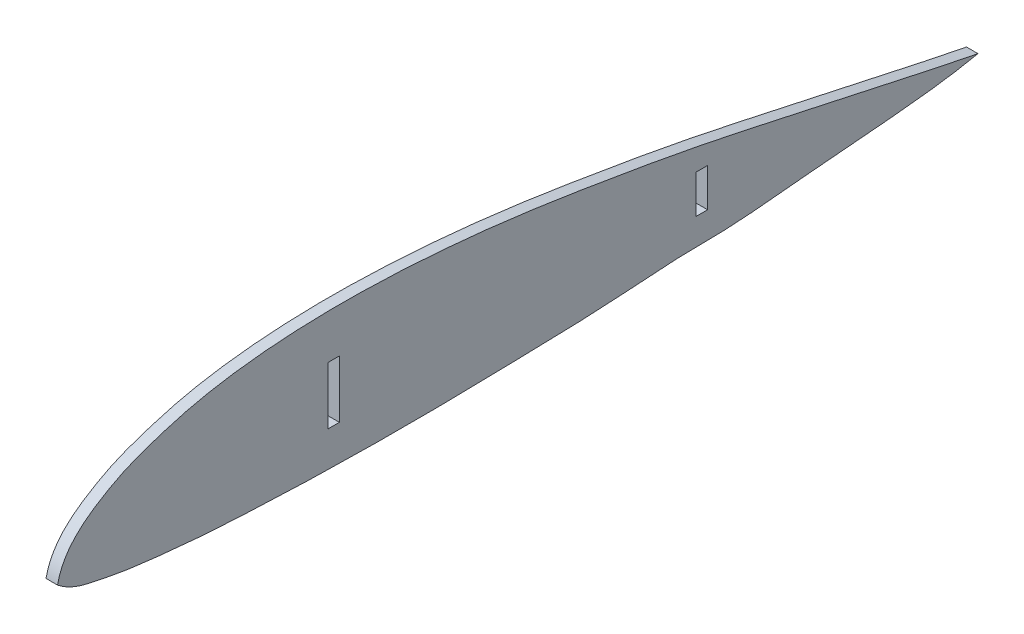
ISO-10303-21;
HEADER;
FILE_DESCRIPTION(('STEP AP214'),'2;1');
FILE_NAME('part.step','',(''),(''),'','','');
FILE_SCHEMA(('AUTOMOTIVE_DESIGN { 1 0 10303 214 1 1 1 1 }'));
ENDSEC;
DATA;
#1=APPLICATION_CONTEXT('core data for automotive mechanical design processes');
#2=APPLICATION_PROTOCOL_DEFINITION('international standard','automotive_design',2000,#1);
#3=PRODUCT_CONTEXT('',#1,'mechanical');
#4=PRODUCT('Part','Part','',(#3));
#5=PRODUCT_RELATED_PRODUCT_CATEGORY('part','',(#4));
#6=PRODUCT_DEFINITION_FORMATION('','',#4);
#7=PRODUCT_DEFINITION_CONTEXT('part definition',#1,'design');
#8=PRODUCT_DEFINITION('design','',#6,#7);
#9=PRODUCT_DEFINITION_SHAPE('','',#8);
#10=(LENGTH_UNIT() NAMED_UNIT(*) SI_UNIT(.MILLI.,.METRE.));
#11=(NAMED_UNIT(*) PLANE_ANGLE_UNIT() SI_UNIT($,.RADIAN.));
#12=(NAMED_UNIT(*) SI_UNIT($,.STERADIAN.) SOLID_ANGLE_UNIT());
#13=UNCERTAINTY_MEASURE_WITH_UNIT(LENGTH_MEASURE(1.E-05),#10,'distance_accuracy_value','');
#14=(GEOMETRIC_REPRESENTATION_CONTEXT(3) GLOBAL_UNCERTAINTY_ASSIGNED_CONTEXT((#13)) GLOBAL_UNIT_ASSIGNED_CONTEXT((#10,
#11,#12)) REPRESENTATION_CONTEXT('',''));
#15=CARTESIAN_POINT('',(0.,0.,0.));
#16=DIRECTION('',(0.,0.,1.));
#17=DIRECTION('',(1.,0.,0.));
#18=AXIS2_PLACEMENT_3D('',#15,#16,#17);
#19=CARTESIAN_POINT('',(3.,0.,240.));
#20=CARTESIAN_POINT('',(3.,-2.88663712280927,236.523911789921));
#21=CARTESIAN_POINT('',(3.,-4.06778606087941,230.220810861395));
#22=CARTESIAN_POINT('',(3.,-5.64877990651582,222.028601874124));
#23=CARTESIAN_POINT('',(3.,-6.60851401532716,214.009642515101));
#24=CARTESIAN_POINT('',(3.,-7.65058139006474,204.019456847261));
#25=CARTESIAN_POINT('',(3.,-8.62100436946901,188.0105436438));
#26=CARTESIAN_POINT('',(3.,-9.35502805275515,168.008371033474));
#27=CARTESIAN_POINT('',(3.,-9.54465584837777,143.997445941081));
#28=CARTESIAN_POINT('',(3.,-9.00057164569615,119.996434597562));
#29=CARTESIAN_POINT('',(3.,-8.45231331914167,95.9841207137069));
#30=CARTESIAN_POINT('',(3.,-6.86154925632092,79.4444514819222));
#31=CARTESIAN_POINT('',(3.,-6.94135781790873,63.4128510279465));
#32=CARTESIAN_POINT('',(3.,-5.14929657813988,47.4214800178839));
#33=CARTESIAN_POINT('',(3.,-3.34616289016771,23.9519910613881));
#34=CARTESIAN_POINT('',(3.,-1.67223814751534,7.91601145609598));
#35=CARTESIAN_POINT('',(3.,0.,0.));
#36=B_SPLINE_CURVE_WITH_KNOTS('',3,(#19,#20,#21,#22,#23,#24,#25,#26,#27,#28,#29,#30,#31,#32,#33,
#34,#35),.UNSPECIFIED.,.F.,.F.,(4,1,1,1,1,1,1,1,1,1,1,1,1,1,4),(0.,0.0534752742490124,
0.078709310431568,0.103753203869046,0.153672751320013,0.203448048800785,0.302856430572072,
0.402198969890009,0.501554024856561,0.600954522211836,0.700430480598882,0.70748041607058,
0.79999645484155,0.899715684831644,1.),.UNSPECIFIED.);
#37=DIRECTION('',(-1.,0.,0.));
#38=VECTOR('',#37,1.);
#39=SURFACE_OF_LINEAR_EXTRUSION('',#36,#38);
#40=CARTESIAN_POINT('',(0.,0.,240.));
#41=CARTESIAN_POINT('',(0.,-2.88663712280927,236.523911789921));
#42=CARTESIAN_POINT('',(0.,-4.06778606087941,230.220810861395));
#43=CARTESIAN_POINT('',(0.,-5.64877990651582,222.028601874124));
#44=CARTESIAN_POINT('',(0.,-6.60851401532716,214.009642515101));
#45=CARTESIAN_POINT('',(0.,-7.65058139006474,204.019456847261));
#46=CARTESIAN_POINT('',(0.,-8.62100436946901,188.0105436438));
#47=CARTESIAN_POINT('',(0.,-9.35502805275515,168.008371033474));
#48=CARTESIAN_POINT('',(0.,-9.54465584837777,143.997445941081));
#49=CARTESIAN_POINT('',(0.,-9.00057164569615,119.996434597562));
#50=CARTESIAN_POINT('',(0.,-8.45231331914167,95.9841207137069));
#51=CARTESIAN_POINT('',(0.,-6.86154925632092,79.4444514819222));
#52=CARTESIAN_POINT('',(0.,-6.94135781790873,63.4128510279465));
#53=CARTESIAN_POINT('',(0.,-5.14929657813988,47.4214800178839));
#54=CARTESIAN_POINT('',(0.,-3.34616289016771,23.9519910613881));
#55=CARTESIAN_POINT('',(0.,-1.67223814751534,7.91601145609598));
#56=CARTESIAN_POINT('',(0.,0.,0.));
#57=B_SPLINE_CURVE_WITH_KNOTS('',3,(#40,#41,#42,#43,#44,#45,#46,#47,#48,#49,#50,#51,#52,#53,#54,
#55,#56),.UNSPECIFIED.,.F.,.F.,(4,1,1,1,1,1,1,1,1,1,1,1,1,1,4),(0.,0.0534752742490124,
0.078709310431568,0.103753203869046,0.153672751320013,0.203448048800785,0.302856430572072,
0.402198969890009,0.501554024856561,0.600954522211836,0.700430480598882,0.70748041607058,
0.79999645484155,0.899715684831644,1.),.UNSPECIFIED.);
#58=CARTESIAN_POINT('',(0.,0.,240.));
#59=VERTEX_POINT('',#58);
#60=CARTESIAN_POINT('',(0.,0.,0.));
#61=VERTEX_POINT('',#60);
#62=EDGE_CURVE('E168',#59,#61,#57,.T.);
#63=ORIENTED_EDGE('',*,*,#62,.T.);
#64=DIRECTION('',(-1.,0.,0.));
#65=VECTOR('',#64,1.);
#66=CARTESIAN_POINT('',(3.,0.,0.));
#67=LINE('',#66,#65);
#68=CARTESIAN_POINT('',(3.,0.,0.));
#69=VERTEX_POINT('',#68);
#70=EDGE_CURVE('E11',#69,#61,#67,.T.);
#71=ORIENTED_EDGE('',*,*,#70,.F.);
#72=CARTESIAN_POINT('',(3.,0.,240.));
#73=VERTEX_POINT('',#72);
#74=EDGE_CURVE('E214',#73,#69,#36,.T.);
#75=ORIENTED_EDGE('',*,*,#74,.F.);
#76=DIRECTION('',(-1.,0.,0.));
#77=VECTOR('',#76,1.);
#78=CARTESIAN_POINT('',(3.,0.,240.));
#79=LINE('',#78,#77);
#80=EDGE_CURVE('E51',#73,#59,#79,.T.);
#81=ORIENTED_EDGE('',*,*,#80,.T.);
#82=EDGE_LOOP('',(#63,#71,#75,#81));
#83=FACE_BOUND('',#82,.T.);
#84=ADVANCED_FACE('F42',(#83),#39,.F.);
#85=CARTESIAN_POINT('',(3.,0.,0.));
#86=CARTESIAN_POINT('',(3.,1.52360068225762,8.03746926130975));
#87=CARTESIAN_POINT('',(3.,5.17138323074117,23.9897917168263));
#88=CARTESIAN_POINT('',(3.,10.2205786034995,48.0059783922376));
#89=CARTESIAN_POINT('',(3.,15.5619770262737,71.9126579513757));
#90=CARTESIAN_POINT('',(3.,19.7588120032883,95.9537600079154));
#91=CARTESIAN_POINT('',(3.,23.5677508672796,119.918298993928));
#92=CARTESIAN_POINT('',(3.,26.0263882263808,143.945589986485));
#93=CARTESIAN_POINT('',(3.,26.9601439821251,168.007150596988));
#94=CARTESIAN_POINT('',(3.,25.8933216802265,188.104616678397));
#95=CARTESIAN_POINT('',(3.,23.2639042392419,204.156129060536));
#96=CARTESIAN_POINT('',(3.,20.3434828261758,214.111867769092));
#97=CARTESIAN_POINT('',(3.,17.4120912155664,222.175332594537));
#98=CARTESIAN_POINT('',(3.,12.3378274401084,231.611968899749));
#99=CARTESIAN_POINT('',(3.,6.88597595591278,238.539586147514));
#100=CARTESIAN_POINT('',(3.,0.,240.));
#101=B_SPLINE_CURVE_WITH_KNOTS('',3,(#85,#86,#87,#88,#89,#90,#91,#92,#93,#94,#95,#96,#97,#98,
#99,#100),.UNSPECIFIED.,.F.,.F.,(4,1,1,1,1,1,1,1,1,1,1,1,1,4),(0.,0.0976537739938577,
0.195364998835535,0.293026196954694,0.390079704897671,0.486695277187024,0.582699676897636,
0.678273314662547,0.77397516907434,0.822435696462195,0.872109787552887,0.897672395288057,
0.924653988799848,1.),.UNSPECIFIED.);
#102=DIRECTION('',(-1.,0.,0.));
#103=VECTOR('',#102,1.);
#104=SURFACE_OF_LINEAR_EXTRUSION('',#101,#103);
#105=CARTESIAN_POINT('',(0.,0.,0.));
#106=CARTESIAN_POINT('',(0.,1.52360068225762,8.03746926130975));
#107=CARTESIAN_POINT('',(0.,5.17138323074117,23.9897917168263));
#108=CARTESIAN_POINT('',(0.,10.2205786034995,48.0059783922376));
#109=CARTESIAN_POINT('',(0.,15.5619770262737,71.9126579513757));
#110=CARTESIAN_POINT('',(0.,19.7588120032883,95.9537600079154));
#111=CARTESIAN_POINT('',(0.,23.5677508672796,119.918298993928));
#112=CARTESIAN_POINT('',(0.,26.0263882263808,143.945589986485));
#113=CARTESIAN_POINT('',(0.,26.9601439821251,168.007150596988));
#114=CARTESIAN_POINT('',(0.,25.8933216802265,188.104616678397));
#115=CARTESIAN_POINT('',(0.,23.2639042392419,204.156129060536));
#116=CARTESIAN_POINT('',(0.,20.3434828261758,214.111867769092));
#117=CARTESIAN_POINT('',(0.,17.4120912155664,222.175332594537));
#118=CARTESIAN_POINT('',(0.,12.3378274401084,231.611968899749));
#119=CARTESIAN_POINT('',(0.,6.88597595591278,238.539586147514));
#120=CARTESIAN_POINT('',(0.,0.,240.));
#121=B_SPLINE_CURVE_WITH_KNOTS('',3,(#105,#106,#107,#108,#109,#110,#111,#112,#113,#114,#115,
#116,#117,#118,#119,#120),.UNSPECIFIED.,.F.,.F.,(4,1,1,1,1,1,1,1,1,1,1,1,1,4),(0.,
0.0976537739938577,0.195364998835535,0.293026196954694,0.390079704897671,0.486695277187024,
0.582699676897636,0.678273314662547,0.77397516907434,0.822435696462195,0.872109787552887,
0.897672395288057,0.924653988799848,1.),.UNSPECIFIED.);
#122=EDGE_CURVE('E222',#61,#59,#121,.T.);
#123=ORIENTED_EDGE('',*,*,#122,.T.);
#124=ORIENTED_EDGE('',*,*,#80,.F.);
#125=EDGE_CURVE('E221',#69,#73,#101,.T.);
#126=ORIENTED_EDGE('',*,*,#125,.F.);
#127=ORIENTED_EDGE('',*,*,#70,.T.);
#128=EDGE_LOOP('',(#123,#124,#126,#127));
#129=FACE_BOUND('',#128,.T.);
#130=ADVANCED_FACE('F237',(#129),#104,.F.);
#131=CARTESIAN_POINT('',(3.,-9.00853891874286,120.375365675922));
#132=DIRECTION('',(-1.,0.,0.));
#133=DIRECTION('',(0.,0.,1.));
#134=AXIS2_PLACEMENT_3D('',#131,#132,#133);
#135=PLANE('',#134);
#136=DIRECTION('',(0.,-1.,0.));
#137=VECTOR('',#136,1.);
#138=CARTESIAN_POINT('',(3.,15.,166.5));
#139=LINE('',#138,#137);
#140=CARTESIAN_POINT('',(3.,15.,166.5));
#141=VERTEX_POINT('',#140);
#142=CARTESIAN_POINT('',(3.,0.,166.5));
#143=VERTEX_POINT('',#142);
#144=EDGE_CURVE('E133',#141,#143,#139,.T.);
#145=ORIENTED_EDGE('',*,*,#144,.T.);
#146=DIRECTION('',(0.,0.,1.));
#147=VECTOR('',#146,1.);
#148=CARTESIAN_POINT('',(3.,0.,166.5));
#149=LINE('',#148,#147);
#150=CARTESIAN_POINT('',(3.,0.,169.5));
#151=VERTEX_POINT('',#150);
#152=EDGE_CURVE('E124',#143,#151,#149,.T.);
#153=ORIENTED_EDGE('',*,*,#152,.T.);
#154=DIRECTION('',(0.,1.,0.));
#155=VECTOR('',#154,1.);
#156=CARTESIAN_POINT('',(3.,0.,169.5));
#157=LINE('',#156,#155);
#158=CARTESIAN_POINT('',(3.,15.,169.5));
#159=VERTEX_POINT('',#158);
#160=EDGE_CURVE('E136',#151,#159,#157,.T.);
#161=ORIENTED_EDGE('',*,*,#160,.T.);
#162=DIRECTION('',(0.,0.,-1.));
#163=VECTOR('',#162,1.);
#164=CARTESIAN_POINT('',(3.,15.,169.5));
#165=LINE('',#164,#163);
#166=EDGE_CURVE('E58',#159,#141,#165,.T.);
#167=ORIENTED_EDGE('',*,*,#166,.T.);
#168=EDGE_LOOP('',(#145,#153,#161,#167));
#169=FACE_BOUND('',#168,.T.);
#170=DIRECTION('',(0.,1.,0.));
#171=VECTOR('',#170,1.);
#172=CARTESIAN_POINT('',(3.,10.,73.5));
#173=LINE('',#172,#171);
#174=CARTESIAN_POINT('',(3.,0.,73.5));
#175=VERTEX_POINT('',#174);
#176=CARTESIAN_POINT('',(3.,10.,73.5));
#177=VERTEX_POINT('',#176);
#178=EDGE_CURVE('E178',#175,#177,#173,.T.);
#179=ORIENTED_EDGE('',*,*,#178,.T.);
#180=DIRECTION('',(0.,0.,-1.));
#181=VECTOR('',#180,1.);
#182=CARTESIAN_POINT('',(3.,10.,70.5));
#183=LINE('',#182,#181);
#184=CARTESIAN_POINT('',(3.,10.,70.5));
#185=VERTEX_POINT('',#184);
#186=EDGE_CURVE('E193',#177,#185,#183,.T.);
#187=ORIENTED_EDGE('',*,*,#186,.T.);
#188=DIRECTION('',(0.,-1.,0.));
#189=VECTOR('',#188,1.);
#190=CARTESIAN_POINT('',(3.,0.,70.5));
#191=LINE('',#190,#189);
#192=CARTESIAN_POINT('',(3.,0.,70.5));
#193=VERTEX_POINT('',#192);
#194=EDGE_CURVE('E208',#185,#193,#191,.T.);
#195=ORIENTED_EDGE('',*,*,#194,.T.);
#196=DIRECTION('',(0.,0.,1.));
#197=VECTOR('',#196,1.);
#198=CARTESIAN_POINT('',(3.,0.,70.5));
#199=LINE('',#198,#197);
#200=EDGE_CURVE('E66',#193,#175,#199,.T.);
#201=ORIENTED_EDGE('',*,*,#200,.T.);
#202=EDGE_LOOP('',(#179,#187,#195,#201));
#203=FACE_BOUND('',#202,.T.);
#204=ORIENTED_EDGE('',*,*,#74,.T.);
#205=ORIENTED_EDGE('',*,*,#125,.T.);
#206=EDGE_LOOP('',(#204,#205));
#207=FACE_BOUND('',#206,.T.);
#208=ADVANCED_FACE('F141',(#169,#203,#207),#135,.F.);
#209=CARTESIAN_POINT('',(0.,-9.00853891874286,120.375365675922));
#210=DIRECTION('',(-1.,0.,0.));
#211=DIRECTION('',(0.,0.,1.));
#212=AXIS2_PLACEMENT_3D('',#209,#210,#211);
#213=PLANE('',#212);
#214=DIRECTION('',(0.,0.,1.));
#215=VECTOR('',#214,1.);
#216=CARTESIAN_POINT('',(0.,0.,166.5));
#217=LINE('',#216,#215);
#218=CARTESIAN_POINT('',(0.,0.,166.5));
#219=VERTEX_POINT('',#218);
#220=CARTESIAN_POINT('',(0.,0.,169.5));
#221=VERTEX_POINT('',#220);
#222=EDGE_CURVE('E127',#219,#221,#217,.T.);
#223=ORIENTED_EDGE('',*,*,#222,.F.);
#224=DIRECTION('',(0.,-1.,0.));
#225=VECTOR('',#224,1.);
#226=CARTESIAN_POINT('',(0.,15.,166.5));
#227=LINE('',#226,#225);
#228=CARTESIAN_POINT('',(0.,15.,166.5));
#229=VERTEX_POINT('',#228);
#230=EDGE_CURVE('E145',#229,#219,#227,.T.);
#231=ORIENTED_EDGE('',*,*,#230,.F.);
#232=DIRECTION('',(0.,0.,-1.));
#233=VECTOR('',#232,1.);
#234=CARTESIAN_POINT('',(0.,15.,169.5));
#235=LINE('',#234,#233);
#236=CARTESIAN_POINT('',(0.,15.,169.5));
#237=VERTEX_POINT('',#236);
#238=EDGE_CURVE('E149',#237,#229,#235,.T.);
#239=ORIENTED_EDGE('',*,*,#238,.F.);
#240=DIRECTION('',(0.,1.,0.));
#241=VECTOR('',#240,1.);
#242=CARTESIAN_POINT('',(0.,0.,169.5));
#243=LINE('',#242,#241);
#244=EDGE_CURVE('E158',#221,#237,#243,.T.);
#245=ORIENTED_EDGE('',*,*,#244,.F.);
#246=EDGE_LOOP('',(#223,#231,#239,#245));
#247=FACE_BOUND('',#246,.T.);
#248=DIRECTION('',(0.,0.,-1.));
#249=VECTOR('',#248,1.);
#250=CARTESIAN_POINT('',(0.,10.,70.5));
#251=LINE('',#250,#249);
#252=CARTESIAN_POINT('',(0.,10.,73.5));
#253=VERTEX_POINT('',#252);
#254=CARTESIAN_POINT('',(0.,10.,70.5));
#255=VERTEX_POINT('',#254);
#256=EDGE_CURVE('E159',#253,#255,#251,.T.);
#257=ORIENTED_EDGE('',*,*,#256,.F.);
#258=DIRECTION('',(0.,1.,0.));
#259=VECTOR('',#258,1.);
#260=CARTESIAN_POINT('',(0.,10.,73.5));
#261=LINE('',#260,#259);
#262=CARTESIAN_POINT('',(0.,0.,73.5));
#263=VERTEX_POINT('',#262);
#264=EDGE_CURVE('E188',#263,#253,#261,.T.);
#265=ORIENTED_EDGE('',*,*,#264,.F.);
#266=DIRECTION('',(0.,0.,1.));
#267=VECTOR('',#266,1.);
#268=CARTESIAN_POINT('',(0.,0.,70.5));
#269=LINE('',#268,#267);
#270=CARTESIAN_POINT('',(0.,0.,70.5));
#271=VERTEX_POINT('',#270);
#272=EDGE_CURVE('E192',#271,#263,#269,.T.);
#273=ORIENTED_EDGE('',*,*,#272,.F.);
#274=DIRECTION('',(0.,-1.,0.));
#275=VECTOR('',#274,1.);
#276=CARTESIAN_POINT('',(0.,0.,70.5));
#277=LINE('',#276,#275);
#278=EDGE_CURVE('E197',#255,#271,#277,.T.);
#279=ORIENTED_EDGE('',*,*,#278,.F.);
#280=EDGE_LOOP('',(#257,#265,#273,#279));
#281=FACE_BOUND('',#280,.T.);
#282=ORIENTED_EDGE('',*,*,#62,.F.);
#283=ORIENTED_EDGE('',*,*,#122,.F.);
#284=EDGE_LOOP('',(#282,#283));
#285=FACE_BOUND('',#284,.T.);
#286=ADVANCED_FACE('F241',(#247,#281,#285),#213,.T.);
#287=CARTESIAN_POINT('',(3.,10.,70.5));
#288=DIRECTION('',(0.,1.,0.));
#289=DIRECTION('',(0.,0.,1.));
#290=AXIS2_PLACEMENT_3D('',#287,#288,#289);
#291=PLANE('',#290);
#292=ORIENTED_EDGE('',*,*,#256,.T.);
#293=DIRECTION('',(-1.,0.,0.));
#294=VECTOR('',#293,1.);
#295=CARTESIAN_POINT('',(3.,10.,70.5));
#296=LINE('',#295,#294);
#297=EDGE_CURVE('E174',#185,#255,#296,.T.);
#298=ORIENTED_EDGE('',*,*,#297,.F.);
#299=ORIENTED_EDGE('',*,*,#186,.F.);
#300=DIRECTION('',(-1.,0.,0.));
#301=VECTOR('',#300,1.);
#302=CARTESIAN_POINT('',(3.,10.,73.5));
#303=LINE('',#302,#301);
#304=EDGE_CURVE('E185',#177,#253,#303,.T.);
#305=ORIENTED_EDGE('',*,*,#304,.T.);
#306=EDGE_LOOP('',(#292,#298,#299,#305));
#307=FACE_BOUND('',#306,.T.);
#308=ADVANCED_FACE('F244',(#307),#291,.F.);
#309=CARTESIAN_POINT('',(3.,10.,73.5));
#310=DIRECTION('',(0.,0.,1.));
#311=DIRECTION('',(1.,0.,0.));
#312=AXIS2_PLACEMENT_3D('',#309,#310,#311);
#313=PLANE('',#312);
#314=ORIENTED_EDGE('',*,*,#264,.T.);
#315=ORIENTED_EDGE('',*,*,#304,.F.);
#316=ORIENTED_EDGE('',*,*,#178,.F.);
#317=DIRECTION('',(-1.,0.,0.));
#318=VECTOR('',#317,1.);
#319=CARTESIAN_POINT('',(3.,0.,73.5));
#320=LINE('',#319,#318);
#321=EDGE_CURVE('E182',#175,#263,#320,.T.);
#322=ORIENTED_EDGE('',*,*,#321,.T.);
#323=EDGE_LOOP('',(#314,#315,#316,#322));
#324=FACE_BOUND('',#323,.T.);
#325=ADVANCED_FACE('F248',(#324),#313,.F.);
#326=CARTESIAN_POINT('',(3.,0.,70.5));
#327=DIRECTION('',(0.,-1.,0.));
#328=DIRECTION('',(0.,0.,-1.));
#329=AXIS2_PLACEMENT_3D('',#326,#327,#328);
#330=PLANE('',#329);
#331=ORIENTED_EDGE('',*,*,#272,.T.);
#332=ORIENTED_EDGE('',*,*,#321,.F.);
#333=ORIENTED_EDGE('',*,*,#200,.F.);
#334=DIRECTION('',(-1.,0.,0.));
#335=VECTOR('',#334,1.);
#336=CARTESIAN_POINT('',(3.,0.,70.5));
#337=LINE('',#336,#335);
#338=EDGE_CURVE('E179',#193,#271,#337,.T.);
#339=ORIENTED_EDGE('',*,*,#338,.T.);
#340=EDGE_LOOP('',(#331,#332,#333,#339));
#341=FACE_BOUND('',#340,.T.);
#342=ADVANCED_FACE('F251',(#341),#330,.F.);
#343=CARTESIAN_POINT('',(3.,0.,70.5));
#344=DIRECTION('',(0.,0.,-1.));
#345=DIRECTION('',(-1.,0.,0.));
#346=AXIS2_PLACEMENT_3D('',#343,#344,#345);
#347=PLANE('',#346);
#348=ORIENTED_EDGE('',*,*,#278,.T.);
#349=ORIENTED_EDGE('',*,*,#338,.F.);
#350=ORIENTED_EDGE('',*,*,#194,.F.);
#351=ORIENTED_EDGE('',*,*,#297,.T.);
#352=EDGE_LOOP('',(#348,#349,#350,#351));
#353=FACE_BOUND('',#352,.T.);
#354=ADVANCED_FACE('F255',(#353),#347,.F.);
#355=CARTESIAN_POINT('',(3.,0.,166.5));
#356=DIRECTION('',(0.,-1.,0.));
#357=DIRECTION('',(0.,0.,-1.));
#358=AXIS2_PLACEMENT_3D('',#355,#356,#357);
#359=PLANE('',#358);
#360=ORIENTED_EDGE('',*,*,#222,.T.);
#361=DIRECTION('',(-1.,0.,0.));
#362=VECTOR('',#361,1.);
#363=CARTESIAN_POINT('',(3.,0.,169.5));
#364=LINE('',#363,#362);
#365=EDGE_CURVE('E120',#151,#221,#364,.T.);
#366=ORIENTED_EDGE('',*,*,#365,.F.);
#367=ORIENTED_EDGE('',*,*,#152,.F.);
#368=DIRECTION('',(-1.,0.,0.));
#369=VECTOR('',#368,1.);
#370=CARTESIAN_POINT('',(3.,0.,166.5));
#371=LINE('',#370,#369);
#372=EDGE_CURVE('E165',#143,#219,#371,.T.);
#373=ORIENTED_EDGE('',*,*,#372,.T.);
#374=EDGE_LOOP('',(#360,#366,#367,#373));
#375=FACE_BOUND('',#374,.T.);
#376=ADVANCED_FACE('F122',(#375),#359,.F.);
#377=CARTESIAN_POINT('',(3.,15.,166.5));
#378=DIRECTION('',(0.,0.,-1.));
#379=DIRECTION('',(-1.,0.,0.));
#380=AXIS2_PLACEMENT_3D('',#377,#378,#379);
#381=PLANE('',#380);
#382=ORIENTED_EDGE('',*,*,#230,.T.);
#383=ORIENTED_EDGE('',*,*,#372,.F.);
#384=ORIENTED_EDGE('',*,*,#144,.F.);
#385=DIRECTION('',(-1.,0.,0.));
#386=VECTOR('',#385,1.);
#387=CARTESIAN_POINT('',(3.,15.,166.5));
#388=LINE('',#387,#386);
#389=EDGE_CURVE('E169',#141,#229,#388,.T.);
#390=ORIENTED_EDGE('',*,*,#389,.T.);
#391=EDGE_LOOP('',(#382,#383,#384,#390));
#392=FACE_BOUND('',#391,.T.);
#393=ADVANCED_FACE('F264',(#392),#381,.F.);
#394=CARTESIAN_POINT('',(3.,15.,169.5));
#395=DIRECTION('',(0.,1.,0.));
#396=DIRECTION('',(0.,0.,1.));
#397=AXIS2_PLACEMENT_3D('',#394,#395,#396);
#398=PLANE('',#397);
#399=ORIENTED_EDGE('',*,*,#238,.T.);
#400=ORIENTED_EDGE('',*,*,#389,.F.);
#401=ORIENTED_EDGE('',*,*,#166,.F.);
#402=DIRECTION('',(-1.,0.,0.));
#403=VECTOR('',#402,1.);
#404=CARTESIAN_POINT('',(3.,15.,169.5));
#405=LINE('',#404,#403);
#406=EDGE_CURVE('E132',#159,#237,#405,.T.);
#407=ORIENTED_EDGE('',*,*,#406,.T.);
#408=EDGE_LOOP('',(#399,#400,#401,#407));
#409=FACE_BOUND('',#408,.T.);
#410=ADVANCED_FACE('F267',(#409),#398,.F.);
#411=CARTESIAN_POINT('',(3.,0.,169.5));
#412=DIRECTION('',(0.,0.,1.));
#413=DIRECTION('',(1.,0.,0.));
#414=AXIS2_PLACEMENT_3D('',#411,#412,#413);
#415=PLANE('',#414);
#416=ORIENTED_EDGE('',*,*,#244,.T.);
#417=ORIENTED_EDGE('',*,*,#406,.F.);
#418=ORIENTED_EDGE('',*,*,#160,.F.);
#419=ORIENTED_EDGE('',*,*,#365,.T.);
#420=EDGE_LOOP('',(#416,#417,#418,#419));
#421=FACE_BOUND('',#420,.T.);
#422=ADVANCED_FACE('F137',(#421),#415,.F.);
#423=CLOSED_SHELL('',(#84,#130,#208,#286,#308,#325,#342,#354,#376,#393,#410,#422));
#424=MANIFOLD_SOLID_BREP('B2',#423);
#425=ADVANCED_BREP_SHAPE_REPRESENTATION('',(#18,#424),#14);
#426=SHAPE_DEFINITION_REPRESENTATION(#9,#425);
ENDSEC;
END-ISO-10303-21;
